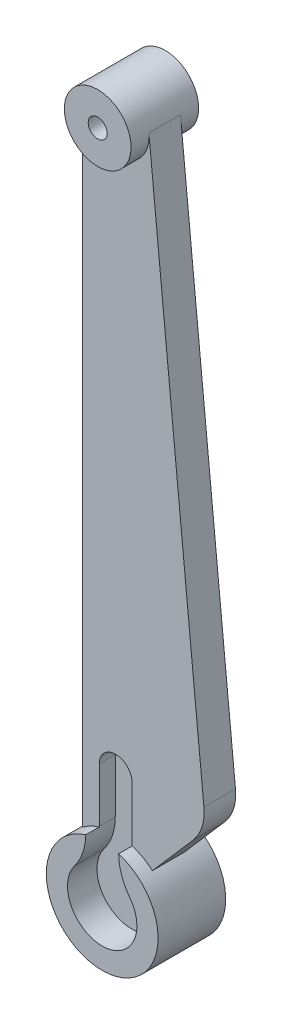
ISO-10303-21;
HEADER;
FILE_DESCRIPTION(('STEP AP214'),'2;1');
FILE_NAME('part.step','',(''),(''),'','','');
FILE_SCHEMA(('AUTOMOTIVE_DESIGN { 1 0 10303 214 1 1 1 1 }'));
ENDSEC;
DATA;
#1=APPLICATION_CONTEXT('core data for automotive mechanical design processes');
#2=APPLICATION_PROTOCOL_DEFINITION('international standard','automotive_design',2000,#1);
#3=PRODUCT_CONTEXT('',#1,'mechanical');
#4=PRODUCT('Part','Part','',(#3));
#5=PRODUCT_RELATED_PRODUCT_CATEGORY('part','',(#4));
#6=PRODUCT_DEFINITION_FORMATION('','',#4);
#7=PRODUCT_DEFINITION_CONTEXT('part definition',#1,'design');
#8=PRODUCT_DEFINITION('design','',#6,#7);
#9=PRODUCT_DEFINITION_SHAPE('','',#8);
#10=(LENGTH_UNIT() NAMED_UNIT(*) SI_UNIT(.MILLI.,.METRE.));
#11=(NAMED_UNIT(*) PLANE_ANGLE_UNIT() SI_UNIT($,.RADIAN.));
#12=(NAMED_UNIT(*) SI_UNIT($,.STERADIAN.) SOLID_ANGLE_UNIT());
#13=UNCERTAINTY_MEASURE_WITH_UNIT(LENGTH_MEASURE(1.E-05),#10,'distance_accuracy_value','');
#14=(GEOMETRIC_REPRESENTATION_CONTEXT(3) GLOBAL_UNCERTAINTY_ASSIGNED_CONTEXT((#13)) GLOBAL_UNIT_ASSIGNED_CONTEXT((#10,
#11,#12)) REPRESENTATION_CONTEXT('',''));
#15=CARTESIAN_POINT('',(0.,0.,0.));
#16=DIRECTION('',(0.,0.,1.));
#17=DIRECTION('',(1.,0.,0.));
#18=AXIS2_PLACEMENT_3D('',#15,#16,#17);
#19=CARTESIAN_POINT('',(0.,0.,4.5));
#20=DIRECTION('',(0.,0.,1.));
#21=DIRECTION('',(1.,0.,0.));
#22=AXIS2_PLACEMENT_3D('',#19,#20,#21);
#23=PLANE('',#22);
#24=DIRECTION('',(0.,-1.,0.));
#25=VECTOR('',#24,1.);
#26=CARTESIAN_POINT('',(3.65,0.,4.5));
#27=LINE('',#26,#25);
#28=CARTESIAN_POINT('',(3.65,24.,4.5));
#29=VERTEX_POINT('',#28);
#30=CARTESIAN_POINT('',(3.65,12.,4.5));
#31=VERTEX_POINT('',#30);
#32=EDGE_CURVE('E269',#29,#31,#27,.T.);
#33=ORIENTED_EDGE('',*,*,#32,.T.);
#34=CARTESIAN_POINT('',(15.75277778,12.,4.5));
#35=DIRECTION('',(0.,0.,1.));
#36=DIRECTION('',(1.,0.,0.));
#37=AXIS2_PLACEMENT_3D('',#34,#35,#36);
#38=CIRCLE('',#37,12.10277778);
#39=CARTESIAN_POINT('',(3.65092526756673,11.8503478721361,4.5));
#40=VERTEX_POINT('',#39);
#41=EDGE_CURVE('E166',#31,#40,#38,.T.);
#42=ORIENTED_EDGE('',*,*,#41,.T.);
#43=CARTESIAN_POINT('',(0.,0.,4.5));
#44=DIRECTION('',(0.,0.,1.));
#45=DIRECTION('',(1.,0.,0.));
#46=AXIS2_PLACEMENT_3D('',#43,#44,#45);
#47=CIRCLE('',#46,12.3999999999999);
#48=CARTESIAN_POINT('',(8.14037745569983,9.35383637224482,4.5));
#49=VERTEX_POINT('',#48);
#50=EDGE_CURVE('E236',#40,#49,#47,.F.);
#51=ORIENTED_EDGE('',*,*,#50,.T.);
#52=DIRECTION('',(0.656482052879027,0.754341642922979,0.));
#53=VECTOR('',#52,1.);
#54=CARTESIAN_POINT('',(0.,0.,4.5));
#55=LINE('',#54,#53);
#56=CARTESIAN_POINT('',(17.1672330321872,19.7262952020534,4.5));
#57=VERTEX_POINT('',#56);
#58=EDGE_CURVE('E217',#49,#57,#55,.T.);
#59=ORIENTED_EDGE('',*,*,#58,.T.);
#60=CARTESIAN_POINT('',(9.62381660295743,26.2911157308437,4.5));
#61=DIRECTION('',(0.,0.,1.));
#62=DIRECTION('',(1.,0.,0.));
#63=AXIS2_PLACEMENT_3D('',#60,#61,#62);
#64=CIRCLE('',#63,10.);
#65=CARTESIAN_POINT('',(19.5752530598213,27.2754492337788,4.5));
#66=VERTEX_POINT('',#65);
#67=EDGE_CURVE('E262',#57,#66,#64,.T.);
#68=ORIENTED_EDGE('',*,*,#67,.T.);
#69=DIRECTION('',(-0.0984333502935076,0.995143645686388,0.));
#70=VECTOR('',#69,1.);
#71=CARTESIAN_POINT('',(22.0573614383096,2.18177545967255,4.5));
#72=LINE('',#71,#70);
#73=CARTESIAN_POINT('',(7.36406297807868,150.728406792172,4.5));
#74=VERTEX_POINT('',#73);
#75=EDGE_CURVE('E226',#66,#74,#72,.T.);
#76=ORIENTED_EDGE('',*,*,#75,.T.);
#77=CARTESIAN_POINT('',(-5.69336244815588E-13,150.,4.5));
#78=DIRECTION('',(0.,0.,1.));
#79=DIRECTION('',(1.,0.,0.));
#80=AXIS2_PLACEMENT_3D('',#77,#78,#79);
#81=CIRCLE('',#80,7.4);
#82=CARTESIAN_POINT('',(-7.40000000000057,150.,4.5));
#83=VERTEX_POINT('',#82);
#84=EDGE_CURVE('E210',#74,#83,#81,.F.);
#85=ORIENTED_EDGE('',*,*,#84,.T.);
#86=DIRECTION('',(0.,-1.,0.));
#87=VECTOR('',#86,1.);
#88=CARTESIAN_POINT('',(-7.4,0.,4.5));
#89=LINE('',#88,#87);
#90=CARTESIAN_POINT('',(-7.40000000000004,9.94987437106636,4.5));
#91=VERTEX_POINT('',#90);
#92=EDGE_CURVE('E233',#83,#91,#89,.T.);
#93=ORIENTED_EDGE('',*,*,#92,.T.);
#94=CARTESIAN_POINT('',(-3.65092526756672,11.8503478721363,4.5));
#95=VERTEX_POINT('',#94);
#96=EDGE_CURVE('E237',#91,#95,#47,.F.);
#97=ORIENTED_EDGE('',*,*,#96,.T.);
#98=CARTESIAN_POINT('',(-15.75277778,12.,4.5));
#99=DIRECTION('',(0.,0.,1.));
#100=DIRECTION('',(1.,0.,0.));
#101=AXIS2_PLACEMENT_3D('',#98,#99,#100);
#102=CIRCLE('',#101,12.10277778);
#103=CARTESIAN_POINT('',(-3.65,12.,4.5));
#104=VERTEX_POINT('',#103);
#105=EDGE_CURVE('E200',#104,#95,#102,.F.);
#106=ORIENTED_EDGE('',*,*,#105,.F.);
#107=DIRECTION('',(0.,-1.,0.));
#108=VECTOR('',#107,1.);
#109=CARTESIAN_POINT('',(-3.65,0.,4.5));
#110=LINE('',#109,#108);
#111=CARTESIAN_POINT('',(-3.65,24.,4.5));
#112=VERTEX_POINT('',#111);
#113=EDGE_CURVE('E52',#112,#104,#110,.T.);
#114=ORIENTED_EDGE('',*,*,#113,.F.);
#115=CARTESIAN_POINT('',(0.,24.,4.5));
#116=DIRECTION('',(0.,0.,1.));
#117=DIRECTION('',(1.,0.,0.));
#118=AXIS2_PLACEMENT_3D('',#115,#116,#117);
#119=CIRCLE('',#118,3.65);
#120=EDGE_CURVE('E271',#29,#112,#119,.T.);
#121=ORIENTED_EDGE('',*,*,#120,.F.);
#122=EDGE_LOOP('',(#33,#42,#51,#59,#68,#76,#85,#93,#97,#106,#114,#121));
#123=FACE_BOUND('',#122,.T.);
#124=ADVANCED_FACE('F43',(#123),#23,.T.);
#125=CARTESIAN_POINT('',(-2.44019343982555E-13,0.,2.5));
#126=DIRECTION('',(0.,0.,-1.));
#127=DIRECTION('',(-1.,0.,0.));
#128=AXIS2_PLACEMENT_3D('',#125,#126,#127);
#129=CYLINDRICAL_SURFACE('',#128,12.4);
#130=CARTESIAN_POINT('',(0.,0.,-7.5));
#131=DIRECTION('',(0.,0.,-1.));
#132=DIRECTION('',(-1.,0.,0.));
#133=AXIS2_PLACEMENT_3D('',#130,#131,#132);
#134=CIRCLE('',#133,12.4000000000002);
#135=CARTESIAN_POINT('',(-12.4000000000002,0.,-7.5));
#136=VERTEX_POINT('',#135);
#137=EDGE_CURVE('E244',#136,#136,#134,.T.);
#138=ORIENTED_EDGE('',*,*,#137,.F.);
#139=EDGE_LOOP('',(#138));
#140=FACE_BOUND('',#139,.T.);
#141=ORIENTED_EDGE('',*,*,#50,.F.);
#142=DIRECTION('',(0.,0.,1.));
#143=VECTOR('',#142,1.);
#144=CARTESIAN_POINT('',(3.65092526756673,11.8503478721361,4.225));
#145=LINE('',#144,#143);
#146=CARTESIAN_POINT('',(3.65092526756673,11.8503478721361,7.5));
#147=VERTEX_POINT('',#146);
#148=EDGE_CURVE('E202',#40,#147,#145,.T.);
#149=ORIENTED_EDGE('',*,*,#148,.T.);
#150=CARTESIAN_POINT('',(0.,0.,7.5));
#151=DIRECTION('',(0.,0.,1.));
#152=DIRECTION('',(1.,0.,0.));
#153=AXIS2_PLACEMENT_3D('',#150,#151,#152);
#154=CIRCLE('',#153,12.3999999999999);
#155=CARTESIAN_POINT('',(-3.65092526756672,11.8503478721361,7.5));
#156=VERTEX_POINT('',#155);
#157=EDGE_CURVE('E240',#156,#147,#154,.T.);
#158=ORIENTED_EDGE('',*,*,#157,.F.);
#159=DIRECTION('',(0.,0.,1.));
#160=VECTOR('',#159,1.);
#161=CARTESIAN_POINT('',(-3.65092526756672,11.8503478721363,4.225));
#162=LINE('',#161,#160);
#163=EDGE_CURVE('E60',#95,#156,#162,.T.);
#164=ORIENTED_EDGE('',*,*,#163,.F.);
#165=ORIENTED_EDGE('',*,*,#96,.F.);
#166=DIRECTION('',(0.,0.,-1.));
#167=VECTOR('',#166,1.);
#168=CARTESIAN_POINT('',(-7.40000000000004,9.94987437106636,2.5));
#169=LINE('',#168,#167);
#170=CARTESIAN_POINT('',(-7.40000000000007,9.94987437106639,-2.5));
#171=VERTEX_POINT('',#170);
#172=EDGE_CURVE('E250',#91,#171,#169,.T.);
#173=ORIENTED_EDGE('',*,*,#172,.T.);
#174=CARTESIAN_POINT('',(0.,0.,-2.5));
#175=DIRECTION('',(0.,0.,-1.));
#176=DIRECTION('',(-1.,0.,0.));
#177=AXIS2_PLACEMENT_3D('',#174,#175,#176);
#178=CIRCLE('',#177,12.4000000000002);
#179=CARTESIAN_POINT('',(8.14037745569983,9.35383637224482,-2.5));
#180=VERTEX_POINT('',#179);
#181=EDGE_CURVE('E243',#171,#180,#178,.T.);
#182=ORIENTED_EDGE('',*,*,#181,.T.);
#183=DIRECTION('',(0.,0.,-1.));
#184=VECTOR('',#183,1.);
#185=CARTESIAN_POINT('',(8.14037745569983,9.35383637224482,2.5));
#186=LINE('',#185,#184);
#187=EDGE_CURVE('E253',#180,#49,#186,.F.);
#188=ORIENTED_EDGE('',*,*,#187,.T.);
#189=EDGE_LOOP('',(#141,#149,#158,#164,#165,#173,#182,#188));
#190=FACE_BOUND('',#189,.T.);
#191=ADVANCED_FACE('F285',(#140,#190),#129,.T.);
#192=CARTESIAN_POINT('',(-5.69336244815588E-13,150.,-7.501));
#193=DIRECTION('',(0.,0.,1.));
#194=DIRECTION('',(1.,0.,0.));
#195=AXIS2_PLACEMENT_3D('',#192,#193,#194);
#196=CYLINDRICAL_SURFACE('',#195,7.4);
#197=DIRECTION('',(0.,0.,1.));
#198=VECTOR('',#197,1.);
#199=CARTESIAN_POINT('',(-7.40000000000052,150.,-7.501));
#200=LINE('',#199,#198);
#201=CARTESIAN_POINT('',(-7.40000000000056,150.,-2.5));
#202=VERTEX_POINT('',#201);
#203=EDGE_CURVE('E224',#202,#83,#200,.T.);
#204=ORIENTED_EDGE('',*,*,#203,.T.);
#205=ORIENTED_EDGE('',*,*,#84,.F.);
#206=DIRECTION('',(0.,0.,-1.));
#207=VECTOR('',#206,1.);
#208=CARTESIAN_POINT('',(7.36406297807866,150.728406792172,156.549507115632));
#209=LINE('',#208,#207);
#210=CARTESIAN_POINT('',(7.3640629780787,150.728406792172,-2.5));
#211=VERTEX_POINT('',#210);
#212=EDGE_CURVE('E222',#74,#211,#209,.T.);
#213=ORIENTED_EDGE('',*,*,#212,.T.);
#214=CARTESIAN_POINT('',(-5.69336244815588E-13,150.,-2.5));
#215=DIRECTION('',(0.,0.,1.));
#216=DIRECTION('',(1.,0.,0.));
#217=AXIS2_PLACEMENT_3D('',#214,#215,#216);
#218=CIRCLE('',#217,7.4);
#219=EDGE_CURVE('E214',#211,#202,#218,.F.);
#220=ORIENTED_EDGE('',*,*,#219,.T.);
#221=EDGE_LOOP('',(#204,#205,#213,#220));
#222=FACE_BOUND('',#221,.T.);
#223=CARTESIAN_POINT('',(-5.69336244815588E-13,150.,8.5));
#224=DIRECTION('',(0.,0.,1.));
#225=DIRECTION('',(1.,0.,0.));
#226=AXIS2_PLACEMENT_3D('',#223,#224,#225);
#227=CIRCLE('',#226,7.4);
#228=CARTESIAN_POINT('',(7.39999999999943,150.,8.5));
#229=VERTEX_POINT('',#228);
#230=EDGE_CURVE('E207',#229,#229,#227,.T.);
#231=ORIENTED_EDGE('',*,*,#230,.F.);
#232=EDGE_LOOP('',(#231));
#233=FACE_BOUND('',#232,.T.);
#234=CARTESIAN_POINT('',(-5.69336244815588E-13,150.,-6.5));
#235=DIRECTION('',(0.,0.,1.));
#236=DIRECTION('',(1.,0.,0.));
#237=AXIS2_PLACEMENT_3D('',#234,#235,#236);
#238=CIRCLE('',#237,7.4);
#239=CARTESIAN_POINT('',(7.39999999999943,150.,-6.5));
#240=VERTEX_POINT('',#239);
#241=EDGE_CURVE('E206',#240,#240,#238,.T.);
#242=ORIENTED_EDGE('',*,*,#241,.T.);
#243=EDGE_LOOP('',(#242));
#244=FACE_BOUND('',#243,.T.);
#245=ADVANCED_FACE('F310',(#222,#233,#244),#196,.T.);
#246=CARTESIAN_POINT('',(0.,0.,-2.5));
#247=DIRECTION('',(0.,0.,1.));
#248=DIRECTION('',(1.,0.,0.));
#249=AXIS2_PLACEMENT_3D('',#246,#247,#248);
#250=PLANE('',#249);
#251=ORIENTED_EDGE('',*,*,#219,.F.);
#252=DIRECTION('',(-0.0984333502935076,0.995143645686388,0.));
#253=VECTOR('',#252,1.);
#254=CARTESIAN_POINT('',(22.0573614383096,2.18177545967255,-2.5));
#255=LINE('',#254,#253);
#256=CARTESIAN_POINT('',(19.5752530598213,27.2754492337788,-2.5));
#257=VERTEX_POINT('',#256);
#258=EDGE_CURVE('E218',#257,#211,#255,.T.);
#259=ORIENTED_EDGE('',*,*,#258,.F.);
#260=CARTESIAN_POINT('',(9.62381660295743,26.2911157308437,-2.5));
#261=DIRECTION('',(0.,0.,1.));
#262=DIRECTION('',(1.,0.,0.));
#263=AXIS2_PLACEMENT_3D('',#260,#261,#262);
#264=CIRCLE('',#263,10.);
#265=CARTESIAN_POINT('',(17.1672330321872,19.7262952020534,-2.5));
#266=VERTEX_POINT('',#265);
#267=EDGE_CURVE('E259',#257,#266,#264,.F.);
#268=ORIENTED_EDGE('',*,*,#267,.T.);
#269=DIRECTION('',(0.656482052879027,0.754341642922979,0.));
#270=VECTOR('',#269,1.);
#271=CARTESIAN_POINT('',(0.,0.,-2.5));
#272=LINE('',#271,#270);
#273=EDGE_CURVE('E221',#180,#266,#272,.T.);
#274=ORIENTED_EDGE('',*,*,#273,.F.);
#275=ORIENTED_EDGE('',*,*,#181,.F.);
#276=DIRECTION('',(0.,-1.,0.));
#277=VECTOR('',#276,1.);
#278=CARTESIAN_POINT('',(-7.4,0.,-2.5));
#279=LINE('',#278,#277);
#280=EDGE_CURVE('E247',#202,#171,#279,.T.);
#281=ORIENTED_EDGE('',*,*,#280,.F.);
#282=EDGE_LOOP('',(#251,#259,#268,#274,#275,#281));
#283=FACE_BOUND('',#282,.T.);
#284=ADVANCED_FACE('F297',(#283),#250,.F.);
#285=CARTESIAN_POINT('',(-7.4,0.,2.5));
#286=DIRECTION('',(1.,0.,0.));
#287=DIRECTION('',(0.,1.,0.));
#288=AXIS2_PLACEMENT_3D('',#285,#286,#287);
#289=PLANE('',#288);
#290=ORIENTED_EDGE('',*,*,#280,.T.);
#291=ORIENTED_EDGE('',*,*,#172,.F.);
#292=ORIENTED_EDGE('',*,*,#92,.F.);
#293=ORIENTED_EDGE('',*,*,#203,.F.);
#294=EDGE_LOOP('',(#290,#291,#292,#293));
#295=FACE_BOUND('',#294,.T.);
#296=ADVANCED_FACE('F309',(#295),#289,.F.);
#297=CARTESIAN_POINT('',(0.,0.,-7.5));
#298=DIRECTION('',(0.,0.,-1.));
#299=DIRECTION('',(-1.,0.,0.));
#300=AXIS2_PLACEMENT_3D('',#297,#298,#299);
#301=PLANE('',#300);
#302=CARTESIAN_POINT('',(-2.44019343982555E-13,0.,-7.5));
#303=DIRECTION('',(0.,0.,-1.));
#304=DIRECTION('',(-1.,0.,0.));
#305=AXIS2_PLACEMENT_3D('',#302,#303,#304);
#306=CIRCLE('',#305,4.);
#307=CARTESIAN_POINT('',(-4.00000000000024,0.,-7.5));
#308=VERTEX_POINT('',#307);
#309=EDGE_CURVE('E11',#308,#308,#306,.T.);
#310=ORIENTED_EDGE('',*,*,#309,.F.);
#311=EDGE_LOOP('',(#310));
#312=FACE_BOUND('',#311,.T.);
#313=ORIENTED_EDGE('',*,*,#137,.T.);
#314=EDGE_LOOP('',(#313));
#315=FACE_BOUND('',#314,.T.);
#316=ADVANCED_FACE('F344',(#312,#315),#301,.T.);
#317=CARTESIAN_POINT('',(0.,0.,7.5));
#318=DIRECTION('',(0.,0.,1.));
#319=DIRECTION('',(1.,0.,0.));
#320=AXIS2_PLACEMENT_3D('',#317,#318,#319);
#321=PLANE('',#320);
#322=ORIENTED_EDGE('',*,*,#157,.T.);
#323=CARTESIAN_POINT('',(15.75277778,12.,7.5));
#324=DIRECTION('',(0.,0.,1.));
#325=DIRECTION('',(1.,0.,0.));
#326=AXIS2_PLACEMENT_3D('',#323,#324,#325);
#327=CIRCLE('',#326,12.10277778);
#328=CARTESIAN_POINT('',(6.12522092855725,4.66601206271107,7.5));
#329=VERTEX_POINT('',#328);
#330=EDGE_CURVE('E266',#147,#329,#327,.T.);
#331=ORIENTED_EDGE('',*,*,#330,.T.);
#332=CARTESIAN_POINT('',(0.,0.,7.5));
#333=DIRECTION('',(0.,0.,1.));
#334=DIRECTION('',(1.,0.,0.));
#335=AXIS2_PLACEMENT_3D('',#332,#333,#334);
#336=CIRCLE('',#335,7.69999999954552);
#337=CARTESIAN_POINT('',(-6.12522092855724,4.66601206271107,7.5));
#338=VERTEX_POINT('',#337);
#339=EDGE_CURVE('E173',#338,#329,#336,.T.);
#340=ORIENTED_EDGE('',*,*,#339,.F.);
#341=CARTESIAN_POINT('',(-15.75277778,12.,7.5));
#342=DIRECTION('',(0.,0.,1.));
#343=DIRECTION('',(1.,0.,0.));
#344=AXIS2_PLACEMENT_3D('',#341,#342,#343);
#345=CIRCLE('',#344,12.10277778);
#346=EDGE_CURVE('E264',#156,#338,#345,.F.);
#347=ORIENTED_EDGE('',*,*,#346,.F.);
#348=EDGE_LOOP('',(#322,#331,#340,#347));
#349=FACE_BOUND('',#348,.T.);
#350=ADVANCED_FACE('F289',(#349),#321,.T.);
#351=CARTESIAN_POINT('',(22.0573614383096,2.18177545967255,156.549507115632));
#352=DIRECTION('',(-0.995143645686388,-0.0984333502935076,0.));
#353=DIRECTION('',(0.0984333502935076,-0.995143645686388,0.));
#354=AXIS2_PLACEMENT_3D('',#351,#352,#353);
#355=PLANE('',#354);
#356=ORIENTED_EDGE('',*,*,#75,.F.);
#357=DIRECTION('',(0.,0.,-1.));
#358=VECTOR('',#357,1.);
#359=CARTESIAN_POINT('',(19.5752530598213,27.2754492337788,156.549507115632));
#360=LINE('',#359,#358);
#361=EDGE_CURVE('E256',#66,#257,#360,.T.);
#362=ORIENTED_EDGE('',*,*,#361,.T.);
#363=ORIENTED_EDGE('',*,*,#258,.T.);
#364=ORIENTED_EDGE('',*,*,#212,.F.);
#365=EDGE_LOOP('',(#356,#362,#363,#364));
#366=FACE_BOUND('',#365,.T.);
#367=ADVANCED_FACE('F305',(#366),#355,.F.);
#368=CARTESIAN_POINT('',(0.,0.,156.549507115632));
#369=DIRECTION('',(-0.754341642922979,0.656482052879027,0.));
#370=DIRECTION('',(-0.656482052879027,-0.754341642922979,0.));
#371=AXIS2_PLACEMENT_3D('',#368,#369,#370);
#372=PLANE('',#371);
#373=ORIENTED_EDGE('',*,*,#273,.T.);
#374=DIRECTION('',(0.,0.,-1.));
#375=VECTOR('',#374,1.);
#376=CARTESIAN_POINT('',(17.1672330321872,19.7262952020534,156.549507115632));
#377=LINE('',#376,#375);
#378=EDGE_CURVE('E68',#266,#57,#377,.F.);
#379=ORIENTED_EDGE('',*,*,#378,.T.);
#380=ORIENTED_EDGE('',*,*,#58,.F.);
#381=ORIENTED_EDGE('',*,*,#187,.F.);
#382=EDGE_LOOP('',(#373,#379,#380,#381));
#383=FACE_BOUND('',#382,.T.);
#384=ADVANCED_FACE('F295',(#383),#372,.F.);
#385=CARTESIAN_POINT('',(9.62381660295743,26.2911157308437,156.549507115632));
#386=DIRECTION('',(0.,0.,-1.));
#387=DIRECTION('',(-1.,0.,0.));
#388=AXIS2_PLACEMENT_3D('',#385,#386,#387);
#389=CYLINDRICAL_SURFACE('',#388,10.);
#390=ORIENTED_EDGE('',*,*,#67,.F.);
#391=ORIENTED_EDGE('',*,*,#378,.F.);
#392=ORIENTED_EDGE('',*,*,#267,.F.);
#393=ORIENTED_EDGE('',*,*,#361,.F.);
#394=EDGE_LOOP('',(#390,#391,#392,#393));
#395=FACE_BOUND('',#394,.T.);
#396=ADVANCED_FACE('F45',(#395),#389,.T.);
#397=CARTESIAN_POINT('',(-5.69336244815588E-13,150.,8.5));
#398=DIRECTION('',(0.,0.,1.));
#399=DIRECTION('',(1.,0.,0.));
#400=AXIS2_PLACEMENT_3D('',#397,#398,#399);
#401=PLANE('',#400);
#402=CARTESIAN_POINT('',(-5.69336244815588E-13,150.,8.5));
#403=DIRECTION('',(0.,0.,1.));
#404=DIRECTION('',(1.,0.,0.));
#405=AXIS2_PLACEMENT_3D('',#402,#403,#404);
#406=CIRCLE('',#405,2.1);
#407=CARTESIAN_POINT('',(2.09999999999943,150.,8.5));
#408=VERTEX_POINT('',#407);
#409=EDGE_CURVE('E178',#408,#408,#406,.T.);
#410=ORIENTED_EDGE('',*,*,#409,.F.);
#411=EDGE_LOOP('',(#410));
#412=FACE_BOUND('',#411,.T.);
#413=ORIENTED_EDGE('',*,*,#230,.T.);
#414=EDGE_LOOP('',(#413));
#415=FACE_BOUND('',#414,.T.);
#416=ADVANCED_FACE('F320',(#412,#415),#401,.T.);
#417=CARTESIAN_POINT('',(-5.69336244815588E-13,150.,-6.5));
#418=DIRECTION('',(0.,0.,1.));
#419=DIRECTION('',(1.,0.,0.));
#420=AXIS2_PLACEMENT_3D('',#417,#418,#419);
#421=PLANE('',#420);
#422=CARTESIAN_POINT('',(-5.69336244815588E-13,150.,-6.5));
#423=DIRECTION('',(0.,0.,1.));
#424=DIRECTION('',(1.,0.,0.));
#425=AXIS2_PLACEMENT_3D('',#422,#423,#424);
#426=CIRCLE('',#425,2.1);
#427=CARTESIAN_POINT('',(2.09999999999943,150.,-6.5));
#428=VERTEX_POINT('',#427);
#429=EDGE_CURVE('E47',#428,#428,#426,.T.);
#430=ORIENTED_EDGE('',*,*,#429,.T.);
#431=EDGE_LOOP('',(#430));
#432=FACE_BOUND('',#431,.T.);
#433=ORIENTED_EDGE('',*,*,#241,.F.);
#434=EDGE_LOOP('',(#433));
#435=FACE_BOUND('',#434,.T.);
#436=ADVANCED_FACE('F318',(#432,#435),#421,.F.);
#437=CARTESIAN_POINT('',(15.75277778,12.,0.95));
#438=DIRECTION('',(0.,0.,1.));
#439=DIRECTION('',(1.,0.,0.));
#440=AXIS2_PLACEMENT_3D('',#437,#438,#439);
#441=CYLINDRICAL_SURFACE('',#440,12.10277778);
#442=DIRECTION('',(0.,0.,1.));
#443=VECTOR('',#442,1.);
#444=CARTESIAN_POINT('',(3.65,12.,0.95));
#445=LINE('',#444,#443);
#446=CARTESIAN_POINT('',(3.65,12.,0.95));
#447=VERTEX_POINT('',#446);
#448=EDGE_CURVE('E151',#447,#31,#445,.T.);
#449=ORIENTED_EDGE('',*,*,#448,.F.);
#450=CARTESIAN_POINT('',(15.75277778,12.,0.95));
#451=DIRECTION('',(0.,0.,1.));
#452=DIRECTION('',(1.,0.,0.));
#453=AXIS2_PLACEMENT_3D('',#450,#451,#452);
#454=CIRCLE('',#453,12.10277778);
#455=CARTESIAN_POINT('',(6.12522092855725,4.66601206271107,0.95));
#456=VERTEX_POINT('',#455);
#457=EDGE_CURVE('E160',#447,#456,#454,.T.);
#458=ORIENTED_EDGE('',*,*,#457,.T.);
#459=DIRECTION('',(0.,0.,1.));
#460=VECTOR('',#459,1.);
#461=CARTESIAN_POINT('',(6.12522092855725,4.66601206271107,0.95));
#462=LINE('',#461,#460);
#463=EDGE_CURVE('E187',#456,#329,#462,.T.);
#464=ORIENTED_EDGE('',*,*,#463,.T.);
#465=ORIENTED_EDGE('',*,*,#330,.F.);
#466=ORIENTED_EDGE('',*,*,#148,.F.);
#467=ORIENTED_EDGE('',*,*,#41,.F.);
#468=EDGE_LOOP('',(#449,#458,#464,#465,#466,#467));
#469=FACE_BOUND('',#468,.T.);
#470=ADVANCED_FACE('F163',(#469),#441,.T.);
#471=CARTESIAN_POINT('',(0.,0.,0.95));
#472=DIRECTION('',(0.,0.,1.));
#473=DIRECTION('',(1.,0.,0.));
#474=AXIS2_PLACEMENT_3D('',#471,#472,#473);
#475=CYLINDRICAL_SURFACE('',#474,7.69999999954552);
#476=ORIENTED_EDGE('',*,*,#339,.T.);
#477=ORIENTED_EDGE('',*,*,#463,.F.);
#478=CARTESIAN_POINT('',(0.,0.,0.95));
#479=DIRECTION('',(0.,0.,1.));
#480=DIRECTION('',(1.,0.,0.));
#481=AXIS2_PLACEMENT_3D('',#478,#479,#480);
#482=CIRCLE('',#481,7.69999999954552);
#483=CARTESIAN_POINT('',(-6.12522092855724,4.66601206271107,0.95));
#484=VERTEX_POINT('',#483);
#485=EDGE_CURVE('E167',#484,#456,#482,.T.);
#486=ORIENTED_EDGE('',*,*,#485,.F.);
#487=DIRECTION('',(0.,0.,1.));
#488=VECTOR('',#487,1.);
#489=CARTESIAN_POINT('',(-6.12522092855724,4.66601206271107,0.95));
#490=LINE('',#489,#488);
#491=EDGE_CURVE('E189',#484,#338,#490,.T.);
#492=ORIENTED_EDGE('',*,*,#491,.T.);
#493=EDGE_LOOP('',(#476,#477,#486,#492));
#494=FACE_BOUND('',#493,.T.);
#495=ADVANCED_FACE('F292',(#494),#475,.F.);
#496=CARTESIAN_POINT('',(-15.75277778,12.,0.95));
#497=DIRECTION('',(0.,0.,1.));
#498=DIRECTION('',(1.,0.,0.));
#499=AXIS2_PLACEMENT_3D('',#496,#497,#498);
#500=CYLINDRICAL_SURFACE('',#499,12.10277778);
#501=ORIENTED_EDGE('',*,*,#105,.T.);
#502=ORIENTED_EDGE('',*,*,#163,.T.);
#503=ORIENTED_EDGE('',*,*,#346,.T.);
#504=ORIENTED_EDGE('',*,*,#491,.F.);
#505=CARTESIAN_POINT('',(-15.75277778,12.,0.95));
#506=DIRECTION('',(0.,0.,1.));
#507=DIRECTION('',(1.,0.,0.));
#508=AXIS2_PLACEMENT_3D('',#505,#506,#507);
#509=CIRCLE('',#508,12.10277778);
#510=CARTESIAN_POINT('',(-3.65,12.,0.95));
#511=VERTEX_POINT('',#510);
#512=EDGE_CURVE('E184',#511,#484,#509,.F.);
#513=ORIENTED_EDGE('',*,*,#512,.F.);
#514=DIRECTION('',(0.,0.,1.));
#515=VECTOR('',#514,1.);
#516=CARTESIAN_POINT('',(-3.65,12.,0.95));
#517=LINE('',#516,#515);
#518=EDGE_CURVE('E192',#511,#104,#517,.T.);
#519=ORIENTED_EDGE('',*,*,#518,.T.);
#520=EDGE_LOOP('',(#501,#502,#503,#504,#513,#519));
#521=FACE_BOUND('',#520,.T.);
#522=ADVANCED_FACE('F280',(#521),#500,.T.);
#523=CARTESIAN_POINT('',(-3.65,0.,0.95));
#524=DIRECTION('',(-1.,0.,0.));
#525=DIRECTION('',(0.,-1.,0.));
#526=AXIS2_PLACEMENT_3D('',#523,#524,#525);
#527=PLANE('',#526);
#528=ORIENTED_EDGE('',*,*,#113,.T.);
#529=ORIENTED_EDGE('',*,*,#518,.F.);
#530=DIRECTION('',(0.,-1.,0.));
#531=VECTOR('',#530,1.);
#532=CARTESIAN_POINT('',(-3.65,0.,0.95));
#533=LINE('',#532,#531);
#534=CARTESIAN_POINT('',(-3.65,24.,0.95));
#535=VERTEX_POINT('',#534);
#536=EDGE_CURVE('E181',#535,#511,#533,.T.);
#537=ORIENTED_EDGE('',*,*,#536,.F.);
#538=DIRECTION('',(0.,0.,1.));
#539=VECTOR('',#538,1.);
#540=CARTESIAN_POINT('',(-3.65,24.,0.95));
#541=LINE('',#540,#539);
#542=EDGE_CURVE('E195',#535,#112,#541,.T.);
#543=ORIENTED_EDGE('',*,*,#542,.T.);
#544=EDGE_LOOP('',(#528,#529,#537,#543));
#545=FACE_BOUND('',#544,.T.);
#546=ADVANCED_FACE('F274',(#545),#527,.F.);
#547=CARTESIAN_POINT('',(0.,24.,0.95));
#548=DIRECTION('',(0.,0.,1.));
#549=DIRECTION('',(1.,0.,0.));
#550=AXIS2_PLACEMENT_3D('',#547,#548,#549);
#551=CYLINDRICAL_SURFACE('',#550,3.65);
#552=ORIENTED_EDGE('',*,*,#120,.T.);
#553=ORIENTED_EDGE('',*,*,#542,.F.);
#554=CARTESIAN_POINT('',(0.,24.,0.95));
#555=DIRECTION('',(0.,0.,1.));
#556=DIRECTION('',(1.,0.,0.));
#557=AXIS2_PLACEMENT_3D('',#554,#555,#556);
#558=CIRCLE('',#557,3.65);
#559=CARTESIAN_POINT('',(3.65,24.,0.95));
#560=VERTEX_POINT('',#559);
#561=EDGE_CURVE('E159',#560,#535,#558,.T.);
#562=ORIENTED_EDGE('',*,*,#561,.F.);
#563=DIRECTION('',(0.,0.,1.));
#564=VECTOR('',#563,1.);
#565=CARTESIAN_POINT('',(3.65,24.,0.95));
#566=LINE('',#565,#564);
#567=EDGE_CURVE('E154',#560,#29,#566,.T.);
#568=ORIENTED_EDGE('',*,*,#567,.T.);
#569=EDGE_LOOP('',(#552,#553,#562,#568));
#570=FACE_BOUND('',#569,.T.);
#571=ADVANCED_FACE('F450',(#570),#551,.F.);
#572=CARTESIAN_POINT('',(3.65,0.,0.95));
#573=DIRECTION('',(-1.,0.,0.));
#574=DIRECTION('',(0.,-1.,0.));
#575=AXIS2_PLACEMENT_3D('',#572,#573,#574);
#576=PLANE('',#575);
#577=ORIENTED_EDGE('',*,*,#567,.F.);
#578=DIRECTION('',(0.,-1.,0.));
#579=VECTOR('',#578,1.);
#580=CARTESIAN_POINT('',(3.65,0.,0.95));
#581=LINE('',#580,#579);
#582=EDGE_CURVE('E148',#560,#447,#581,.T.);
#583=ORIENTED_EDGE('',*,*,#582,.T.);
#584=ORIENTED_EDGE('',*,*,#448,.T.);
#585=ORIENTED_EDGE('',*,*,#32,.F.);
#586=EDGE_LOOP('',(#577,#583,#584,#585));
#587=FACE_BOUND('',#586,.T.);
#588=ADVANCED_FACE('F150',(#587),#576,.T.);
#589=CARTESIAN_POINT('',(0.,0.,0.95));
#590=DIRECTION('',(0.,0.,1.));
#591=DIRECTION('',(1.,0.,0.));
#592=AXIS2_PLACEMENT_3D('',#589,#590,#591);
#593=PLANE('',#592);
#594=ORIENTED_EDGE('',*,*,#457,.F.);
#595=ORIENTED_EDGE('',*,*,#582,.F.);
#596=ORIENTED_EDGE('',*,*,#561,.T.);
#597=ORIENTED_EDGE('',*,*,#536,.T.);
#598=ORIENTED_EDGE('',*,*,#512,.T.);
#599=ORIENTED_EDGE('',*,*,#485,.T.);
#600=EDGE_LOOP('',(#594,#595,#596,#597,#598,#599));
#601=FACE_BOUND('',#600,.T.);
#602=ADVANCED_FACE('F170',(#601),#593,.T.);
#603=CARTESIAN_POINT('',(-5.69336244815588E-13,150.,-7.5));
#604=DIRECTION('',(0.,0.,1.));
#605=DIRECTION('',(1.,0.,0.));
#606=AXIS2_PLACEMENT_3D('',#603,#604,#605);
#607=CYLINDRICAL_SURFACE('',#606,2.1);
#608=ORIENTED_EDGE('',*,*,#409,.T.);
#609=EDGE_LOOP('',(#608));
#610=FACE_BOUND('',#609,.T.);
#611=ORIENTED_EDGE('',*,*,#429,.F.);
#612=EDGE_LOOP('',(#611));
#613=FACE_BOUND('',#612,.T.);
#614=ADVANCED_FACE('F475',(#610,#613),#607,.F.);
#615=CARTESIAN_POINT('',(-2.44019343982555E-13,0.,-12.5));
#616=DIRECTION('',(0.,0.,1.));
#617=DIRECTION('',(1.,0.,0.));
#618=AXIS2_PLACEMENT_3D('',#615,#616,#617);
#619=CYLINDRICAL_SURFACE('',#618,4.);
#620=CARTESIAN_POINT('',(-2.44019343982555E-13,0.,-12.5));
#621=DIRECTION('',(0.,0.,-1.));
#622=DIRECTION('',(-1.,0.,0.));
#623=AXIS2_PLACEMENT_3D('',#620,#621,#622);
#624=CIRCLE('',#623,4.);
#625=CARTESIAN_POINT('',(-4.00000000000024,0.,-12.5));
#626=VERTEX_POINT('',#625);
#627=EDGE_CURVE('E514',#626,#626,#624,.T.);
#628=ORIENTED_EDGE('',*,*,#627,.F.);
#629=EDGE_LOOP('',(#628));
#630=FACE_BOUND('',#629,.T.);
#631=ORIENTED_EDGE('',*,*,#309,.T.);
#632=EDGE_LOOP('',(#631));
#633=FACE_BOUND('',#632,.T.);
#634=ADVANCED_FACE('F489',(#630,#633),#619,.T.);
#635=CARTESIAN_POINT('',(-2.44019343982555E-13,0.,-12.5));
#636=DIRECTION('',(0.,0.,-1.));
#637=DIRECTION('',(-1.,0.,0.));
#638=AXIS2_PLACEMENT_3D('',#635,#636,#637);
#639=PLANE('',#638);
#640=ORIENTED_EDGE('',*,*,#627,.T.);
#641=EDGE_LOOP('',(#640));
#642=FACE_BOUND('',#641,.T.);
#643=ADVANCED_FACE('F499',(#642),#639,.T.);
#644=CLOSED_SHELL('',(#124,#191,#245,#284,#296,#316,#350,#367,#384,#396,#416,#436,#470,#495,
#522,#546,#571,#588,#602,#614,#634,#643));
#645=MANIFOLD_SOLID_BREP('B2',#644);
#646=ADVANCED_BREP_SHAPE_REPRESENTATION('',(#18,#645),#14);
#647=SHAPE_DEFINITION_REPRESENTATION(#9,#646);
ENDSEC;
END-ISO-10303-21;
